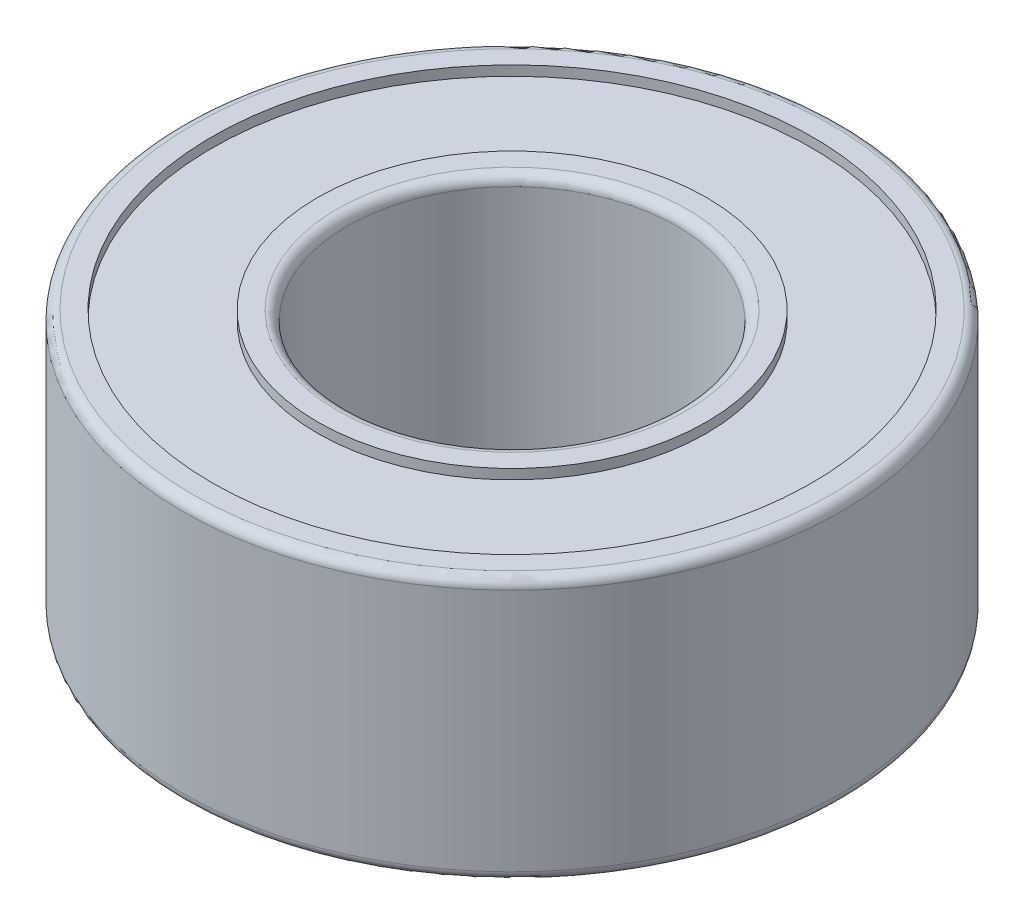
ISO-10303-21;
HEADER;
FILE_DESCRIPTION(('STEP AP214'),'2;1');
FILE_NAME('part.step','',(''),(''),'','','');
FILE_SCHEMA(('AUTOMOTIVE_DESIGN { 1 0 10303 214 1 1 1 1 }'));
ENDSEC;
DATA;
#1=APPLICATION_CONTEXT('core data for automotive mechanical design processes');
#2=APPLICATION_PROTOCOL_DEFINITION('international standard','automotive_design',2000,#1);
#3=PRODUCT_CONTEXT('',#1,'mechanical');
#4=PRODUCT('Part','Part','',(#3));
#5=PRODUCT_RELATED_PRODUCT_CATEGORY('part','',(#4));
#6=PRODUCT_DEFINITION_FORMATION('','',#4);
#7=PRODUCT_DEFINITION_CONTEXT('part definition',#1,'design');
#8=PRODUCT_DEFINITION('design','',#6,#7);
#9=PRODUCT_DEFINITION_SHAPE('','',#8);
#10=(LENGTH_UNIT() NAMED_UNIT(*) SI_UNIT(.MILLI.,.METRE.));
#11=(NAMED_UNIT(*) PLANE_ANGLE_UNIT() SI_UNIT($,.RADIAN.));
#12=(NAMED_UNIT(*) SI_UNIT($,.STERADIAN.) SOLID_ANGLE_UNIT());
#13=UNCERTAINTY_MEASURE_WITH_UNIT(LENGTH_MEASURE(1.E-05),#10,'distance_accuracy_value','');
#14=(GEOMETRIC_REPRESENTATION_CONTEXT(3) GLOBAL_UNCERTAINTY_ASSIGNED_CONTEXT((#13)) GLOBAL_UNIT_ASSIGNED_CONTEXT((#10,
#11,#12)) REPRESENTATION_CONTEXT('',''));
#15=CARTESIAN_POINT('',(0.,0.,0.));
#16=DIRECTION('',(0.,0.,1.));
#17=DIRECTION('',(1.,0.,0.));
#18=AXIS2_PLACEMENT_3D('',#15,#16,#17);
#19=CARTESIAN_POINT('',(0.,-1.85,0.));
#20=DIRECTION('',(0.,1.,0.));
#21=DIRECTION('',(0.,0.,1.));
#22=AXIS2_PLACEMENT_3D('',#19,#20,#21);
#23=TOROIDAL_SURFACE('',#22,2.65,0.150000000000001);
#24=CARTESIAN_POINT('',(0.,-1.85,0.));
#25=DIRECTION('',(0.,1.,0.));
#26=DIRECTION('',(0.,0.,1.));
#27=AXIS2_PLACEMENT_3D('',#24,#25,#26);
#28=CIRCLE('',#27,2.5);
#29=CARTESIAN_POINT('',(0.,-1.85,2.5));
#30=VERTEX_POINT('',#29);
#31=EDGE_CURVE('E10',#30,#30,#28,.T.);
#32=ORIENTED_EDGE('',*,*,#31,.T.);
#33=EDGE_LOOP('',(#32));
#34=FACE_BOUND('',#33,.T.);
#35=CARTESIAN_POINT('',(0.,-2.,0.));
#36=DIRECTION('',(0.,1.,0.));
#37=DIRECTION('',(0.,0.,1.));
#38=AXIS2_PLACEMENT_3D('',#35,#36,#37);
#39=CIRCLE('',#38,2.65);
#40=CARTESIAN_POINT('',(0.,-2.,2.65));
#41=VERTEX_POINT('',#40);
#42=EDGE_CURVE('E84',#41,#41,#39,.T.);
#43=ORIENTED_EDGE('',*,*,#42,.F.);
#44=EDGE_LOOP('',(#43));
#45=FACE_BOUND('',#44,.T.);
#46=ADVANCED_FACE('F32',(#34,#45),#23,.T.);
#47=CARTESIAN_POINT('',(0.,-2.00344606578273,0.));
#48=DIRECTION('',(0.,1.,0.));
#49=DIRECTION('',(0.,0.,1.));
#50=AXIS2_PLACEMENT_3D('',#47,#48,#49);
#51=CYLINDRICAL_SURFACE('',#50,2.5);
#52=CARTESIAN_POINT('',(0.,1.85,0.));
#53=DIRECTION('',(0.,1.,0.));
#54=DIRECTION('',(0.,0.,1.));
#55=AXIS2_PLACEMENT_3D('',#52,#53,#54);
#56=CIRCLE('',#55,2.5);
#57=CARTESIAN_POINT('',(0.,1.85,2.5));
#58=VERTEX_POINT('',#57);
#59=EDGE_CURVE('E38',#58,#58,#56,.T.);
#60=ORIENTED_EDGE('',*,*,#59,.T.);
#61=EDGE_LOOP('',(#60));
#62=FACE_BOUND('',#61,.T.);
#63=ORIENTED_EDGE('',*,*,#31,.F.);
#64=EDGE_LOOP('',(#63));
#65=FACE_BOUND('',#64,.T.);
#66=ADVANCED_FACE('F92',(#62,#65),#51,.F.);
#67=CARTESIAN_POINT('',(0.,1.85,0.));
#68=DIRECTION('',(0.,1.,0.));
#69=DIRECTION('',(0.,0.,1.));
#70=AXIS2_PLACEMENT_3D('',#67,#68,#69);
#71=TOROIDAL_SURFACE('',#70,2.65,0.150000000000001);
#72=CARTESIAN_POINT('',(0.,2.,0.));
#73=DIRECTION('',(0.,1.,0.));
#74=DIRECTION('',(0.,0.,1.));
#75=AXIS2_PLACEMENT_3D('',#72,#73,#74);
#76=CIRCLE('',#75,2.65);
#77=CARTESIAN_POINT('',(0.,2.,2.65));
#78=VERTEX_POINT('',#77);
#79=EDGE_CURVE('E42',#78,#78,#76,.T.);
#80=ORIENTED_EDGE('',*,*,#79,.T.);
#81=EDGE_LOOP('',(#80));
#82=FACE_BOUND('',#81,.T.);
#83=ORIENTED_EDGE('',*,*,#59,.F.);
#84=EDGE_LOOP('',(#83));
#85=FACE_BOUND('',#84,.T.);
#86=ADVANCED_FACE('F96',(#82,#85),#71,.T.);
#87=CARTESIAN_POINT('',(2.65,2.,0.));
#88=DIRECTION('',(0.,1.,0.));
#89=DIRECTION('',(0.,0.,1.));
#90=AXIS2_PLACEMENT_3D('',#87,#88,#89);
#91=PLANE('',#90);
#92=CARTESIAN_POINT('',(0.,2.,0.));
#93=DIRECTION('',(0.,1.,0.));
#94=DIRECTION('',(0.,0.,1.));
#95=AXIS2_PLACEMENT_3D('',#92,#93,#94);
#96=CIRCLE('',#95,2.95);
#97=CARTESIAN_POINT('',(0.,2.,2.95));
#98=VERTEX_POINT('',#97);
#99=EDGE_CURVE('E46',#98,#98,#96,.T.);
#100=ORIENTED_EDGE('',*,*,#99,.T.);
#101=EDGE_LOOP('',(#100));
#102=FACE_BOUND('',#101,.T.);
#103=ORIENTED_EDGE('',*,*,#79,.F.);
#104=EDGE_LOOP('',(#103));
#105=FACE_BOUND('',#104,.T.);
#106=ADVANCED_FACE('F100',(#102,#105),#91,.T.);
#107=CARTESIAN_POINT('',(0.,-2.00344606578273,0.));
#108=DIRECTION('',(0.,1.,0.));
#109=DIRECTION('',(0.,0.,1.));
#110=AXIS2_PLACEMENT_3D('',#107,#108,#109);
#111=CYLINDRICAL_SURFACE('',#110,2.95);
#112=CARTESIAN_POINT('',(0.,1.85,0.));
#113=DIRECTION('',(0.,1.,0.));
#114=DIRECTION('',(0.,0.,1.));
#115=AXIS2_PLACEMENT_3D('',#112,#113,#114);
#116=CIRCLE('',#115,2.95);
#117=CARTESIAN_POINT('',(0.,1.85,2.95));
#118=VERTEX_POINT('',#117);
#119=EDGE_CURVE('E51',#118,#118,#116,.T.);
#120=ORIENTED_EDGE('',*,*,#119,.T.);
#121=EDGE_LOOP('',(#120));
#122=FACE_BOUND('',#121,.T.);
#123=ORIENTED_EDGE('',*,*,#99,.F.);
#124=EDGE_LOOP('',(#123));
#125=FACE_BOUND('',#124,.T.);
#126=ADVANCED_FACE('F107',(#122,#125),#111,.T.);
#127=CARTESIAN_POINT('',(2.95,1.85,0.));
#128=DIRECTION('',(0.,1.,0.));
#129=DIRECTION('',(0.,0.,1.));
#130=AXIS2_PLACEMENT_3D('',#127,#128,#129);
#131=PLANE('',#130);
#132=CARTESIAN_POINT('',(0.,1.85,0.));
#133=DIRECTION('',(0.,1.,0.));
#134=DIRECTION('',(0.,0.,1.));
#135=AXIS2_PLACEMENT_3D('',#132,#133,#134);
#136=CIRCLE('',#135,4.55);
#137=CARTESIAN_POINT('',(0.,1.85,4.55));
#138=VERTEX_POINT('',#137);
#139=EDGE_CURVE('E54',#138,#138,#136,.T.);
#140=ORIENTED_EDGE('',*,*,#139,.T.);
#141=EDGE_LOOP('',(#140));
#142=FACE_BOUND('',#141,.T.);
#143=ORIENTED_EDGE('',*,*,#119,.F.);
#144=EDGE_LOOP('',(#143));
#145=FACE_BOUND('',#144,.T.);
#146=ADVANCED_FACE('F111',(#142,#145),#131,.T.);
#147=CARTESIAN_POINT('',(0.,-2.00344606578273,0.));
#148=DIRECTION('',(0.,1.,0.));
#149=DIRECTION('',(0.,0.,1.));
#150=AXIS2_PLACEMENT_3D('',#147,#148,#149);
#151=CYLINDRICAL_SURFACE('',#150,4.55);
#152=CARTESIAN_POINT('',(0.,2.,0.));
#153=DIRECTION('',(0.,1.,0.));
#154=DIRECTION('',(0.,0.,1.));
#155=AXIS2_PLACEMENT_3D('',#152,#153,#154);
#156=CIRCLE('',#155,4.55);
#157=CARTESIAN_POINT('',(0.,2.,4.55));
#158=VERTEX_POINT('',#157);
#159=EDGE_CURVE('E57',#158,#158,#156,.T.);
#160=ORIENTED_EDGE('',*,*,#159,.T.);
#161=EDGE_LOOP('',(#160));
#162=FACE_BOUND('',#161,.T.);
#163=ORIENTED_EDGE('',*,*,#139,.F.);
#164=EDGE_LOOP('',(#163));
#165=FACE_BOUND('',#164,.T.);
#166=ADVANCED_FACE('F115',(#162,#165),#151,.F.);
#167=CARTESIAN_POINT('',(4.55,2.,0.));
#168=DIRECTION('',(0.,1.,0.));
#169=DIRECTION('',(0.,0.,1.));
#170=AXIS2_PLACEMENT_3D('',#167,#168,#169);
#171=PLANE('',#170);
#172=CARTESIAN_POINT('',(0.,2.,0.));
#173=DIRECTION('',(0.,1.,0.));
#174=DIRECTION('',(0.,0.,1.));
#175=AXIS2_PLACEMENT_3D('',#172,#173,#174);
#176=CIRCLE('',#175,4.85);
#177=CARTESIAN_POINT('',(0.,2.,4.85));
#178=VERTEX_POINT('',#177);
#179=EDGE_CURVE('E60',#178,#178,#176,.T.);
#180=ORIENTED_EDGE('',*,*,#179,.T.);
#181=EDGE_LOOP('',(#180));
#182=FACE_BOUND('',#181,.T.);
#183=ORIENTED_EDGE('',*,*,#159,.F.);
#184=EDGE_LOOP('',(#183));
#185=FACE_BOUND('',#184,.T.);
#186=ADVANCED_FACE('F119',(#182,#185),#171,.T.);
#187=CARTESIAN_POINT('',(0.,1.85,0.));
#188=DIRECTION('',(0.,1.,0.));
#189=DIRECTION('',(0.,0.,1.));
#190=AXIS2_PLACEMENT_3D('',#187,#188,#189);
#191=TOROIDAL_SURFACE('',#190,4.85,0.150000000000001);
#192=CARTESIAN_POINT('',(0.,1.85,0.));
#193=DIRECTION('',(0.,1.,0.));
#194=DIRECTION('',(0.,0.,1.));
#195=AXIS2_PLACEMENT_3D('',#192,#193,#194);
#196=CIRCLE('',#195,5.);
#197=CARTESIAN_POINT('',(0.,1.85,5.));
#198=VERTEX_POINT('',#197);
#199=EDGE_CURVE('E63',#198,#198,#196,.T.);
#200=ORIENTED_EDGE('',*,*,#199,.T.);
#201=EDGE_LOOP('',(#200));
#202=FACE_BOUND('',#201,.T.);
#203=ORIENTED_EDGE('',*,*,#179,.F.);
#204=EDGE_LOOP('',(#203));
#205=FACE_BOUND('',#204,.T.);
#206=ADVANCED_FACE('F123',(#202,#205),#191,.T.);
#207=CARTESIAN_POINT('',(0.,-2.00344606578273,0.));
#208=DIRECTION('',(0.,1.,0.));
#209=DIRECTION('',(0.,0.,1.));
#210=AXIS2_PLACEMENT_3D('',#207,#208,#209);
#211=CYLINDRICAL_SURFACE('',#210,5.);
#212=CARTESIAN_POINT('',(0.,-1.85,0.));
#213=DIRECTION('',(0.,1.,0.));
#214=DIRECTION('',(0.,0.,1.));
#215=AXIS2_PLACEMENT_3D('',#212,#213,#214);
#216=CIRCLE('',#215,5.);
#217=CARTESIAN_POINT('',(0.,-1.85,5.));
#218=VERTEX_POINT('',#217);
#219=EDGE_CURVE('E66',#218,#218,#216,.T.);
#220=ORIENTED_EDGE('',*,*,#219,.T.);
#221=EDGE_LOOP('',(#220));
#222=FACE_BOUND('',#221,.T.);
#223=ORIENTED_EDGE('',*,*,#199,.F.);
#224=EDGE_LOOP('',(#223));
#225=FACE_BOUND('',#224,.T.);
#226=ADVANCED_FACE('F127',(#222,#225),#211,.T.);
#227=CARTESIAN_POINT('',(0.,-1.85,0.));
#228=DIRECTION('',(0.,1.,0.));
#229=DIRECTION('',(0.,0.,1.));
#230=AXIS2_PLACEMENT_3D('',#227,#228,#229);
#231=TOROIDAL_SURFACE('',#230,4.85,0.150000000000001);
#232=CARTESIAN_POINT('',(0.,-2.,0.));
#233=DIRECTION('',(0.,1.,0.));
#234=DIRECTION('',(0.,0.,1.));
#235=AXIS2_PLACEMENT_3D('',#232,#233,#234);
#236=CIRCLE('',#235,4.85);
#237=CARTESIAN_POINT('',(0.,-2.,4.85));
#238=VERTEX_POINT('',#237);
#239=EDGE_CURVE('E69',#238,#238,#236,.T.);
#240=ORIENTED_EDGE('',*,*,#239,.T.);
#241=EDGE_LOOP('',(#240));
#242=FACE_BOUND('',#241,.T.);
#243=ORIENTED_EDGE('',*,*,#219,.F.);
#244=EDGE_LOOP('',(#243));
#245=FACE_BOUND('',#244,.T.);
#246=ADVANCED_FACE('F131',(#242,#245),#231,.T.);
#247=CARTESIAN_POINT('',(4.85,-2.,0.));
#248=DIRECTION('',(0.,-1.,0.));
#249=DIRECTION('',(0.,0.,-1.));
#250=AXIS2_PLACEMENT_3D('',#247,#248,#249);
#251=PLANE('',#250);
#252=CARTESIAN_POINT('',(0.,-2.,0.));
#253=DIRECTION('',(0.,1.,0.));
#254=DIRECTION('',(0.,0.,1.));
#255=AXIS2_PLACEMENT_3D('',#252,#253,#254);
#256=CIRCLE('',#255,4.55);
#257=CARTESIAN_POINT('',(0.,-2.,4.55));
#258=VERTEX_POINT('',#257);
#259=EDGE_CURVE('E72',#258,#258,#256,.T.);
#260=ORIENTED_EDGE('',*,*,#259,.T.);
#261=EDGE_LOOP('',(#260));
#262=FACE_BOUND('',#261,.T.);
#263=ORIENTED_EDGE('',*,*,#239,.F.);
#264=EDGE_LOOP('',(#263));
#265=FACE_BOUND('',#264,.T.);
#266=ADVANCED_FACE('F135',(#262,#265),#251,.T.);
#267=CARTESIAN_POINT('',(0.,-2.00344606578273,0.));
#268=DIRECTION('',(0.,1.,0.));
#269=DIRECTION('',(0.,0.,1.));
#270=AXIS2_PLACEMENT_3D('',#267,#268,#269);
#271=CYLINDRICAL_SURFACE('',#270,4.55);
#272=CARTESIAN_POINT('',(0.,-1.85,0.));
#273=DIRECTION('',(0.,1.,0.));
#274=DIRECTION('',(0.,0.,1.));
#275=AXIS2_PLACEMENT_3D('',#272,#273,#274);
#276=CIRCLE('',#275,4.55);
#277=CARTESIAN_POINT('',(0.,-1.85,4.55));
#278=VERTEX_POINT('',#277);
#279=EDGE_CURVE('E75',#278,#278,#276,.T.);
#280=ORIENTED_EDGE('',*,*,#279,.T.);
#281=EDGE_LOOP('',(#280));
#282=FACE_BOUND('',#281,.T.);
#283=ORIENTED_EDGE('',*,*,#259,.F.);
#284=EDGE_LOOP('',(#283));
#285=FACE_BOUND('',#284,.T.);
#286=ADVANCED_FACE('F139',(#282,#285),#271,.F.);
#287=CARTESIAN_POINT('',(4.55,-1.85,0.));
#288=DIRECTION('',(0.,-1.,0.));
#289=DIRECTION('',(0.,0.,-1.));
#290=AXIS2_PLACEMENT_3D('',#287,#288,#289);
#291=PLANE('',#290);
#292=CARTESIAN_POINT('',(0.,-1.85,0.));
#293=DIRECTION('',(0.,1.,0.));
#294=DIRECTION('',(0.,0.,1.));
#295=AXIS2_PLACEMENT_3D('',#292,#293,#294);
#296=CIRCLE('',#295,2.95);
#297=CARTESIAN_POINT('',(0.,-1.85,2.95));
#298=VERTEX_POINT('',#297);
#299=EDGE_CURVE('E78',#298,#298,#296,.T.);
#300=ORIENTED_EDGE('',*,*,#299,.T.);
#301=EDGE_LOOP('',(#300));
#302=FACE_BOUND('',#301,.T.);
#303=ORIENTED_EDGE('',*,*,#279,.F.);
#304=EDGE_LOOP('',(#303));
#305=FACE_BOUND('',#304,.T.);
#306=ADVANCED_FACE('F143',(#302,#305),#291,.T.);
#307=CARTESIAN_POINT('',(0.,-2.00344606578273,0.));
#308=DIRECTION('',(0.,1.,0.));
#309=DIRECTION('',(0.,0.,1.));
#310=AXIS2_PLACEMENT_3D('',#307,#308,#309);
#311=CYLINDRICAL_SURFACE('',#310,2.95);
#312=CARTESIAN_POINT('',(0.,-2.,0.));
#313=DIRECTION('',(0.,1.,0.));
#314=DIRECTION('',(0.,0.,1.));
#315=AXIS2_PLACEMENT_3D('',#312,#313,#314);
#316=CIRCLE('',#315,2.95);
#317=CARTESIAN_POINT('',(0.,-2.,2.95));
#318=VERTEX_POINT('',#317);
#319=EDGE_CURVE('E81',#318,#318,#316,.T.);
#320=ORIENTED_EDGE('',*,*,#319,.T.);
#321=EDGE_LOOP('',(#320));
#322=FACE_BOUND('',#321,.T.);
#323=ORIENTED_EDGE('',*,*,#299,.F.);
#324=EDGE_LOOP('',(#323));
#325=FACE_BOUND('',#324,.T.);
#326=ADVANCED_FACE('F147',(#322,#325),#311,.T.);
#327=CARTESIAN_POINT('',(2.95,-2.,0.));
#328=DIRECTION('',(0.,-1.,0.));
#329=DIRECTION('',(0.,0.,-1.));
#330=AXIS2_PLACEMENT_3D('',#327,#328,#329);
#331=PLANE('',#330);
#332=ORIENTED_EDGE('',*,*,#42,.T.);
#333=EDGE_LOOP('',(#332));
#334=FACE_BOUND('',#333,.T.);
#335=ORIENTED_EDGE('',*,*,#319,.F.);
#336=EDGE_LOOP('',(#335));
#337=FACE_BOUND('',#336,.T.);
#338=ADVANCED_FACE('F88',(#334,#337),#331,.T.);
#339=CLOSED_SHELL('',(#46,#66,#86,#106,#126,#146,#166,#186,#206,#226,#246,#266,#286,#306,#326,#338));
#340=MANIFOLD_SOLID_BREP('B2',#339);
#341=ADVANCED_BREP_SHAPE_REPRESENTATION('',(#18,#340),#14);
#342=SHAPE_DEFINITION_REPRESENTATION(#9,#341);
ENDSEC;
END-ISO-10303-21;
